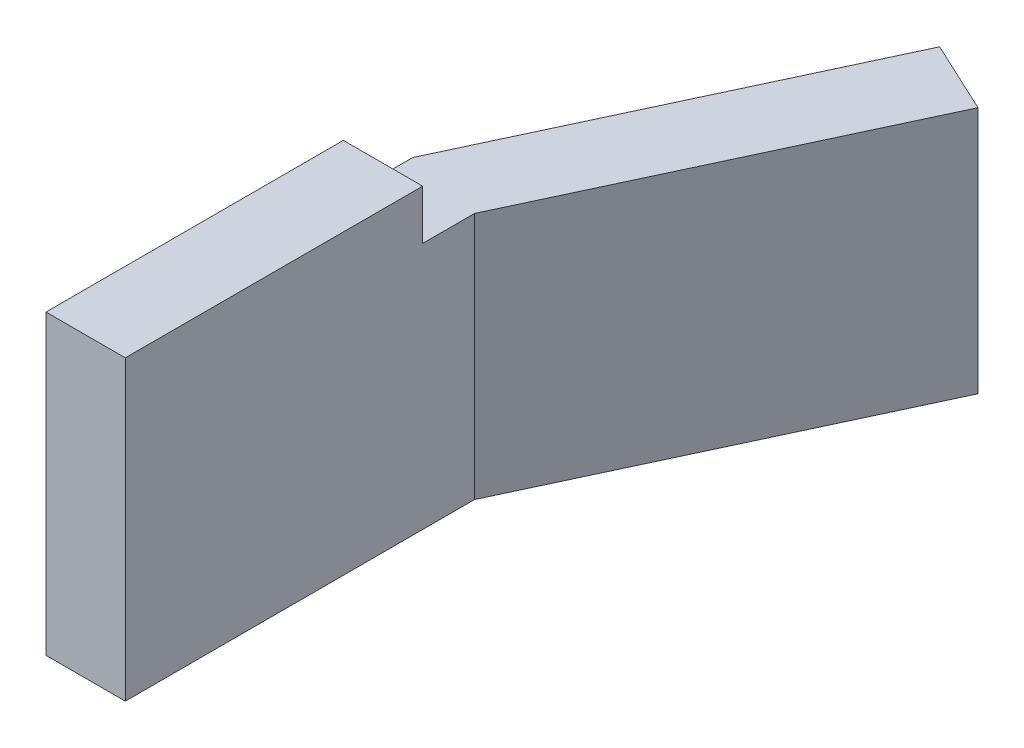
ISO-10303-21;
HEADER;
FILE_DESCRIPTION(('STEP AP214'),'2;1');
FILE_NAME('part.step','',(''),(''),'','','');
FILE_SCHEMA(('AUTOMOTIVE_DESIGN { 1 0 10303 214 1 1 1 1 }'));
ENDSEC;
DATA;
#1=APPLICATION_CONTEXT('core data for automotive mechanical design processes');
#2=APPLICATION_PROTOCOL_DEFINITION('international standard','automotive_design',2000,#1);
#3=PRODUCT_CONTEXT('',#1,'mechanical');
#4=PRODUCT('Part','Part','',(#3));
#5=PRODUCT_RELATED_PRODUCT_CATEGORY('part','',(#4));
#6=PRODUCT_DEFINITION_FORMATION('','',#4);
#7=PRODUCT_DEFINITION_CONTEXT('part definition',#1,'design');
#8=PRODUCT_DEFINITION('design','',#6,#7);
#9=PRODUCT_DEFINITION_SHAPE('','',#8);
#10=(LENGTH_UNIT() NAMED_UNIT(*) SI_UNIT(.MILLI.,.METRE.));
#11=(NAMED_UNIT(*) PLANE_ANGLE_UNIT() SI_UNIT($,.RADIAN.));
#12=(NAMED_UNIT(*) SI_UNIT($,.STERADIAN.) SOLID_ANGLE_UNIT());
#13=UNCERTAINTY_MEASURE_WITH_UNIT(LENGTH_MEASURE(1.E-05),#10,'distance_accuracy_value','');
#14=(GEOMETRIC_REPRESENTATION_CONTEXT(3) GLOBAL_UNCERTAINTY_ASSIGNED_CONTEXT((#13)) GLOBAL_UNIT_ASSIGNED_CONTEXT((#10,
#11,#12)) REPRESENTATION_CONTEXT('',''));
#15=CARTESIAN_POINT('',(0.,0.,0.));
#16=DIRECTION('',(0.,0.,1.));
#17=DIRECTION('',(1.,0.,0.));
#18=AXIS2_PLACEMENT_3D('',#15,#16,#17);
#19=CARTESIAN_POINT('',(16.904730469628,25.,-36.252311481466));
#20=DIRECTION('',(0.906307787036649,0.,0.422618261740701));
#21=DIRECTION('',(-0.422618261740701,0.,0.906307787036649));
#22=AXIS2_PLACEMENT_3D('',#19,#20,#21);
#23=PLANE('',#22);
#24=DIRECTION('',(0.422618261740701,0.,-0.906307787036649));
#25=VECTOR('',#24,1.);
#26=CARTESIAN_POINT('',(16.904730469628,0.,-36.252311481466));
#27=LINE('',#26,#25);
#28=CARTESIAN_POINT('',(0.,0.,0.));
#29=VERTEX_POINT('',#28);
#30=CARTESIAN_POINT('',(16.904730469628,0.,-36.252311481466));
#31=VERTEX_POINT('',#30);
#32=EDGE_CURVE('E142',#29,#31,#27,.T.);
#33=ORIENTED_EDGE('',*,*,#32,.F.);
#34=DIRECTION('',(0.,-1.,0.));
#35=VECTOR('',#34,1.);
#36=CARTESIAN_POINT('',(0.,25.,0.));
#37=LINE('',#36,#35);
#38=CARTESIAN_POINT('',(0.,25.,0.));
#39=VERTEX_POINT('',#38);
#40=EDGE_CURVE('E153',#39,#29,#37,.T.);
#41=ORIENTED_EDGE('',*,*,#40,.F.);
#42=DIRECTION('',(0.422618261740701,0.,-0.906307787036649));
#43=VECTOR('',#42,1.);
#44=CARTESIAN_POINT('',(16.904730469628,25.,-36.252311481466));
#45=LINE('',#44,#43);
#46=CARTESIAN_POINT('',(16.904730469628,25.,-36.252311481466));
#47=VERTEX_POINT('',#46);
#48=EDGE_CURVE('E143',#39,#47,#45,.T.);
#49=ORIENTED_EDGE('',*,*,#48,.T.);
#50=DIRECTION('',(0.,-1.,0.));
#51=VECTOR('',#50,1.);
#52=CARTESIAN_POINT('',(16.904730469628,25.,-36.252311481466));
#53=LINE('',#52,#51);
#54=EDGE_CURVE('E11',#47,#31,#53,.T.);
#55=ORIENTED_EDGE('',*,*,#54,.T.);
#56=EDGE_LOOP('',(#33,#41,#49,#55));
#57=FACE_BOUND('',#56,.T.);
#58=ADVANCED_FACE('F35',(#57),#23,.F.);
#59=CARTESIAN_POINT('',(24.1551927659212,25.,-32.8713653875404));
#60=DIRECTION('',(-0.422618261740701,0.,0.906307787036649));
#61=DIRECTION('',(-0.906307787036649,0.,-0.422618261740701));
#62=AXIS2_PLACEMENT_3D('',#59,#60,#61);
#63=PLANE('',#62);
#64=DIRECTION('',(0.906307787036649,0.,0.422618261740701));
#65=VECTOR('',#64,1.);
#66=CARTESIAN_POINT('',(24.1551927659212,0.,-32.8713653875404));
#67=LINE('',#66,#65);
#68=CARTESIAN_POINT('',(24.1551927659212,0.,-32.8713653875404));
#69=VERTEX_POINT('',#68);
#70=EDGE_CURVE('E155',#31,#69,#67,.T.);
#71=ORIENTED_EDGE('',*,*,#70,.F.);
#72=ORIENTED_EDGE('',*,*,#54,.F.);
#73=DIRECTION('',(0.906307787036649,0.,0.422618261740701));
#74=VECTOR('',#73,1.);
#75=CARTESIAN_POINT('',(24.1551927659212,25.,-32.8713653875404));
#76=LINE('',#75,#74);
#77=CARTESIAN_POINT('',(24.1551927659212,25.,-32.8713653875404));
#78=VERTEX_POINT('',#77);
#79=EDGE_CURVE('E91',#47,#78,#76,.T.);
#80=ORIENTED_EDGE('',*,*,#79,.T.);
#81=DIRECTION('',(0.,-1.,0.));
#82=VECTOR('',#81,1.);
#83=CARTESIAN_POINT('',(24.1551927659212,25.,-32.8713653875404));
#84=LINE('',#83,#82);
#85=EDGE_CURVE('E42',#78,#69,#84,.T.);
#86=ORIENTED_EDGE('',*,*,#85,.T.);
#87=EDGE_LOOP('',(#71,#72,#80,#86));
#88=FACE_BOUND('',#87,.T.);
#89=ADVANCED_FACE('F171',(#88),#63,.F.);
#90=CARTESIAN_POINT('',(8.,25.,1.77355730114351));
#91=DIRECTION('',(-0.906307787036649,0.,-0.422618261740701));
#92=DIRECTION('',(0.422618261740701,0.,-0.906307787036649));
#93=AXIS2_PLACEMENT_3D('',#90,#91,#92);
#94=PLANE('',#93);
#95=DIRECTION('',(-0.422618261740701,0.,0.906307787036649));
#96=VECTOR('',#95,1.);
#97=CARTESIAN_POINT('',(8.,0.,1.77355730114351));
#98=LINE('',#97,#96);
#99=CARTESIAN_POINT('',(8.,0.,1.77355730114351));
#100=VERTEX_POINT('',#99);
#101=EDGE_CURVE('E158',#69,#100,#98,.T.);
#102=ORIENTED_EDGE('',*,*,#101,.F.);
#103=ORIENTED_EDGE('',*,*,#85,.F.);
#104=DIRECTION('',(-0.422618261740701,0.,0.906307787036649));
#105=VECTOR('',#104,1.);
#106=CARTESIAN_POINT('',(8.,25.,1.77355730114351));
#107=LINE('',#106,#105);
#108=CARTESIAN_POINT('',(8.,25.,1.77355730114351));
#109=VERTEX_POINT('',#108);
#110=EDGE_CURVE('E147',#78,#109,#107,.T.);
#111=ORIENTED_EDGE('',*,*,#110,.T.);
#112=DIRECTION('',(0.,-1.,0.));
#113=VECTOR('',#112,1.);
#114=CARTESIAN_POINT('',(8.,25.,1.77355730114351));
#115=LINE('',#114,#113);
#116=EDGE_CURVE('E127',#109,#100,#115,.T.);
#117=ORIENTED_EDGE('',*,*,#116,.T.);
#118=EDGE_LOOP('',(#102,#103,#111,#117));
#119=FACE_BOUND('',#118,.T.);
#120=ADVANCED_FACE('F181',(#119),#94,.F.);
#121=CARTESIAN_POINT('',(8.,25.,37.));
#122=DIRECTION('',(-1.,0.,0.));
#123=DIRECTION('',(0.,0.,-1.));
#124=AXIS2_PLACEMENT_3D('',#121,#122,#123);
#125=PLANE('',#124);
#126=DIRECTION('',(0.,0.,1.));
#127=VECTOR('',#126,1.);
#128=CARTESIAN_POINT('',(8.,0.,37.));
#129=LINE('',#128,#127);
#130=CARTESIAN_POINT('',(8.,0.,37.));
#131=VERTEX_POINT('',#130);
#132=EDGE_CURVE('E161',#100,#131,#129,.T.);
#133=ORIENTED_EDGE('',*,*,#132,.F.);
#134=ORIENTED_EDGE('',*,*,#116,.F.);
#135=DIRECTION('',(0.,0.,1.));
#136=VECTOR('',#135,1.);
#137=CARTESIAN_POINT('',(8.,25.,37.));
#138=LINE('',#137,#136);
#139=CARTESIAN_POINT('',(8.00000000000002,25.,7.));
#140=VERTEX_POINT('',#139);
#141=EDGE_CURVE('E150',#109,#140,#138,.T.);
#142=ORIENTED_EDGE('',*,*,#141,.T.);
#143=DIRECTION('',(0.,-1.,0.));
#144=VECTOR('',#143,1.);
#145=CARTESIAN_POINT('',(8.00000000000002,30.,7.));
#146=LINE('',#145,#144);
#147=CARTESIAN_POINT('',(8.00000000000002,30.,7.));
#148=VERTEX_POINT('',#147);
#149=EDGE_CURVE('E132',#148,#140,#146,.T.);
#150=ORIENTED_EDGE('',*,*,#149,.F.);
#151=DIRECTION('',(0.,0.,1.));
#152=VECTOR('',#151,1.);
#153=CARTESIAN_POINT('',(8.,30.,37.));
#154=LINE('',#153,#152);
#155=CARTESIAN_POINT('',(8.,30.,37.));
#156=VERTEX_POINT('',#155);
#157=EDGE_CURVE('E113',#148,#156,#154,.T.);
#158=ORIENTED_EDGE('',*,*,#157,.T.);
#159=DIRECTION('',(0.,-1.,0.));
#160=VECTOR('',#159,1.);
#161=CARTESIAN_POINT('',(8.,25.,37.));
#162=LINE('',#161,#160);
#163=EDGE_CURVE('E122',#156,#131,#162,.T.);
#164=ORIENTED_EDGE('',*,*,#163,.T.);
#165=EDGE_LOOP('',(#133,#134,#142,#150,#158,#164));
#166=FACE_BOUND('',#165,.T.);
#167=ADVANCED_FACE('F130',(#166),#125,.F.);
#168=CARTESIAN_POINT('',(0.,25.,37.));
#169=DIRECTION('',(0.,0.,-1.));
#170=DIRECTION('',(1.,0.,0.));
#171=AXIS2_PLACEMENT_3D('',#168,#169,#170);
#172=PLANE('',#171);
#173=DIRECTION('',(-1.,0.,0.));
#174=VECTOR('',#173,1.);
#175=CARTESIAN_POINT('',(0.,0.,37.));
#176=LINE('',#175,#174);
#177=CARTESIAN_POINT('',(0.,0.,37.));
#178=VERTEX_POINT('',#177);
#179=EDGE_CURVE('E124',#131,#178,#176,.T.);
#180=ORIENTED_EDGE('',*,*,#179,.F.);
#181=ORIENTED_EDGE('',*,*,#163,.F.);
#182=DIRECTION('',(-1.,0.,0.));
#183=VECTOR('',#182,1.);
#184=CARTESIAN_POINT('',(8.,30.,37.));
#185=LINE('',#184,#183);
#186=CARTESIAN_POINT('',(0.,30.,37.));
#187=VERTEX_POINT('',#186);
#188=EDGE_CURVE('E109',#156,#187,#185,.T.);
#189=ORIENTED_EDGE('',*,*,#188,.T.);
#190=DIRECTION('',(0.,-1.,0.));
#191=VECTOR('',#190,1.);
#192=CARTESIAN_POINT('',(0.,25.,37.));
#193=LINE('',#192,#191);
#194=EDGE_CURVE('E128',#187,#178,#193,.T.);
#195=ORIENTED_EDGE('',*,*,#194,.T.);
#196=EDGE_LOOP('',(#180,#181,#189,#195));
#197=FACE_BOUND('',#196,.T.);
#198=ADVANCED_FACE('F123',(#197),#172,.F.);
#199=CARTESIAN_POINT('',(0.,25.,0.));
#200=DIRECTION('',(1.,0.,0.));
#201=DIRECTION('',(0.,0.,1.));
#202=AXIS2_PLACEMENT_3D('',#199,#200,#201);
#203=PLANE('',#202);
#204=DIRECTION('',(0.,0.,-1.));
#205=VECTOR('',#204,1.);
#206=CARTESIAN_POINT('',(0.,0.,0.));
#207=LINE('',#206,#205);
#208=EDGE_CURVE('E85',#178,#29,#207,.T.);
#209=ORIENTED_EDGE('',*,*,#208,.F.);
#210=ORIENTED_EDGE('',*,*,#194,.F.);
#211=DIRECTION('',(0.,0.,-1.));
#212=VECTOR('',#211,1.);
#213=CARTESIAN_POINT('',(0.,30.,37.));
#214=LINE('',#213,#212);
#215=CARTESIAN_POINT('',(0.,30.,7.));
#216=VERTEX_POINT('',#215);
#217=EDGE_CURVE('E116',#187,#216,#214,.T.);
#218=ORIENTED_EDGE('',*,*,#217,.T.);
#219=DIRECTION('',(0.,-1.,0.));
#220=VECTOR('',#219,1.);
#221=CARTESIAN_POINT('',(0.,30.,7.));
#222=LINE('',#221,#220);
#223=CARTESIAN_POINT('',(0.,25.,7.));
#224=VERTEX_POINT('',#223);
#225=EDGE_CURVE('E140',#216,#224,#222,.T.);
#226=ORIENTED_EDGE('',*,*,#225,.T.);
#227=DIRECTION('',(0.,0.,-1.));
#228=VECTOR('',#227,1.);
#229=CARTESIAN_POINT('',(0.,25.,0.));
#230=LINE('',#229,#228);
#231=EDGE_CURVE('E57',#224,#39,#230,.T.);
#232=ORIENTED_EDGE('',*,*,#231,.T.);
#233=ORIENTED_EDGE('',*,*,#40,.T.);
#234=EDGE_LOOP('',(#209,#210,#218,#226,#232,#233));
#235=FACE_BOUND('',#234,.T.);
#236=ADVANCED_FACE('F178',(#235),#203,.F.);
#237=CARTESIAN_POINT('',(0.,25.,0.));
#238=DIRECTION('',(0.,1.,0.));
#239=DIRECTION('',(0.,0.,-1.));
#240=AXIS2_PLACEMENT_3D('',#237,#238,#239);
#241=PLANE('',#240);
#242=DIRECTION('',(1.,0.,0.));
#243=VECTOR('',#242,1.);
#244=CARTESIAN_POINT('',(8.00000000000002,25.,7.));
#245=LINE('',#244,#243);
#246=EDGE_CURVE('E49',#224,#140,#245,.T.);
#247=ORIENTED_EDGE('',*,*,#246,.T.);
#248=ORIENTED_EDGE('',*,*,#141,.F.);
#249=ORIENTED_EDGE('',*,*,#110,.F.);
#250=ORIENTED_EDGE('',*,*,#79,.F.);
#251=ORIENTED_EDGE('',*,*,#48,.F.);
#252=ORIENTED_EDGE('',*,*,#231,.F.);
#253=EDGE_LOOP('',(#247,#248,#249,#250,#251,#252));
#254=FACE_BOUND('',#253,.T.);
#255=ADVANCED_FACE('F177',(#254),#241,.T.);
#256=CARTESIAN_POINT('',(0.,0.,0.));
#257=DIRECTION('',(0.,1.,0.));
#258=DIRECTION('',(0.,0.,-1.));
#259=AXIS2_PLACEMENT_3D('',#256,#257,#258);
#260=PLANE('',#259);
#261=ORIENTED_EDGE('',*,*,#32,.T.);
#262=ORIENTED_EDGE('',*,*,#70,.T.);
#263=ORIENTED_EDGE('',*,*,#101,.T.);
#264=ORIENTED_EDGE('',*,*,#132,.T.);
#265=ORIENTED_EDGE('',*,*,#179,.T.);
#266=ORIENTED_EDGE('',*,*,#208,.T.);
#267=EDGE_LOOP('',(#261,#262,#263,#264,#265,#266));
#268=FACE_BOUND('',#267,.T.);
#269=ADVANCED_FACE('F173',(#268),#260,.F.);
#270=CARTESIAN_POINT('',(8.00000000000002,30.,7.));
#271=DIRECTION('',(0.,0.,1.));
#272=DIRECTION('',(-1.,0.,0.));
#273=AXIS2_PLACEMENT_3D('',#270,#271,#272);
#274=PLANE('',#273);
#275=ORIENTED_EDGE('',*,*,#246,.F.);
#276=ORIENTED_EDGE('',*,*,#225,.F.);
#277=DIRECTION('',(1.,0.,0.));
#278=VECTOR('',#277,1.);
#279=CARTESIAN_POINT('',(8.00000000000002,30.,7.));
#280=LINE('',#279,#278);
#281=EDGE_CURVE('E137',#216,#148,#280,.T.);
#282=ORIENTED_EDGE('',*,*,#281,.T.);
#283=ORIENTED_EDGE('',*,*,#149,.T.);
#284=EDGE_LOOP('',(#275,#276,#282,#283));
#285=FACE_BOUND('',#284,.T.);
#286=ADVANCED_FACE('F179',(#285),#274,.F.);
#287=CARTESIAN_POINT('',(0.,30.,0.));
#288=DIRECTION('',(0.,-1.,0.));
#289=DIRECTION('',(0.,0.,1.));
#290=AXIS2_PLACEMENT_3D('',#287,#288,#289);
#291=PLANE('',#290);
#292=ORIENTED_EDGE('',*,*,#157,.F.);
#293=ORIENTED_EDGE('',*,*,#281,.F.);
#294=ORIENTED_EDGE('',*,*,#217,.F.);
#295=ORIENTED_EDGE('',*,*,#188,.F.);
#296=EDGE_LOOP('',(#292,#293,#294,#295));
#297=FACE_BOUND('',#296,.T.);
#298=ADVANCED_FACE('F111',(#297),#291,.F.);
#299=CLOSED_SHELL('',(#58,#89,#120,#167,#198,#236,#255,#269,#286,#298));
#300=MANIFOLD_SOLID_BREP('B2',#299);
#301=ADVANCED_BREP_SHAPE_REPRESENTATION('',(#18,#300),#14);
#302=SHAPE_DEFINITION_REPRESENTATION(#9,#301);
ENDSEC;
END-ISO-10303-21;
